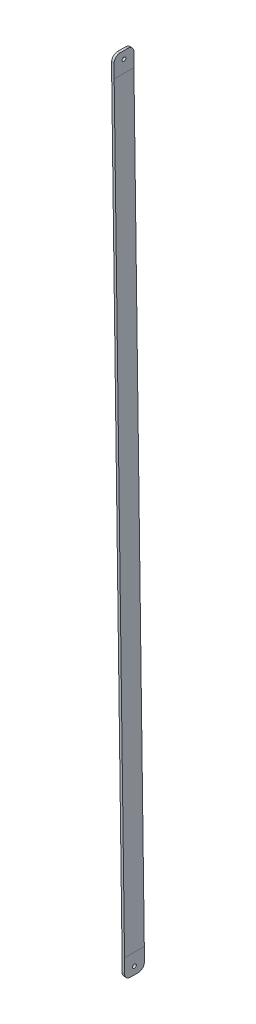
ISO-10303-21;
HEADER;
FILE_DESCRIPTION(('STEP AP214'),'2;1');
FILE_NAME('part.step','',(''),(''),'','','');
FILE_SCHEMA(('AUTOMOTIVE_DESIGN { 1 0 10303 214 1 1 1 1 }'));
ENDSEC;
DATA;
#1=APPLICATION_CONTEXT('core data for automotive mechanical design processes');
#2=APPLICATION_PROTOCOL_DEFINITION('international standard','automotive_design',2000,#1);
#3=PRODUCT_CONTEXT('',#1,'mechanical');
#4=PRODUCT('Part','Part','',(#3));
#5=PRODUCT_RELATED_PRODUCT_CATEGORY('part','',(#4));
#6=PRODUCT_DEFINITION_FORMATION('','',#4);
#7=PRODUCT_DEFINITION_CONTEXT('part definition',#1,'design');
#8=PRODUCT_DEFINITION('design','',#6,#7);
#9=PRODUCT_DEFINITION_SHAPE('','',#8);
#10=(LENGTH_UNIT() NAMED_UNIT(*) SI_UNIT(.MILLI.,.METRE.));
#11=(NAMED_UNIT(*) PLANE_ANGLE_UNIT() SI_UNIT($,.RADIAN.));
#12=(NAMED_UNIT(*) SI_UNIT($,.STERADIAN.) SOLID_ANGLE_UNIT());
#13=UNCERTAINTY_MEASURE_WITH_UNIT(LENGTH_MEASURE(1.E-05),#10,'distance_accuracy_value','');
#14=(GEOMETRIC_REPRESENTATION_CONTEXT(3) GLOBAL_UNCERTAINTY_ASSIGNED_CONTEXT((#13)) GLOBAL_UNIT_ASSIGNED_CONTEXT((#10,
#11,#12)) REPRESENTATION_CONTEXT('',''));
#15=CARTESIAN_POINT('',(0.,0.,0.));
#16=DIRECTION('',(0.,0.,1.));
#17=DIRECTION('',(1.,0.,0.));
#18=AXIS2_PLACEMENT_3D('',#15,#16,#17);
#19=CARTESIAN_POINT('',(0.,0.,12.7));
#20=DIRECTION('',(1.,0.,0.));
#21=DIRECTION('',(0.,0.,-1.));
#22=AXIS2_PLACEMENT_3D('',#19,#20,#21);
#23=PLANE('',#22);
#24=CARTESIAN_POINT('',(0.,9.65199999999977,0.));
#25=DIRECTION('',(1.,0.,0.));
#26=DIRECTION('',(0.,0.,-1.));
#27=AXIS2_PLACEMENT_3D('',#24,#25,#26);
#28=CIRCLE('',#27,2.413);
#29=CARTESIAN_POINT('',(0.,9.65199999999977,-2.413));
#30=VERTEX_POINT('',#29);
#31=EDGE_CURVE('E163',#30,#30,#28,.T.);
#32=ORIENTED_EDGE('',*,*,#31,.T.);
#33=EDGE_LOOP('',(#32));
#34=FACE_BOUND('',#33,.T.);
#35=DIRECTION('',(0.,0.,-1.));
#36=VECTOR('',#35,1.);
#37=CARTESIAN_POINT('',(0.,0.,12.7));
#38=LINE('',#37,#36);
#39=CARTESIAN_POINT('',(0.,0.,5.08));
#40=VERTEX_POINT('',#39);
#41=CARTESIAN_POINT('',(0.,0.,-5.08));
#42=VERTEX_POINT('',#41);
#43=EDGE_CURVE('E186',#40,#42,#38,.T.);
#44=ORIENTED_EDGE('',*,*,#43,.F.);
#45=CARTESIAN_POINT('',(0.,7.62,5.08));
#46=DIRECTION('',(1.,0.,0.));
#47=DIRECTION('',(0.,0.,-1.));
#48=AXIS2_PLACEMENT_3D('',#45,#46,#47);
#49=CIRCLE('',#48,7.62);
#50=CARTESIAN_POINT('',(0.,7.62,12.7));
#51=VERTEX_POINT('',#50);
#52=EDGE_CURVE('E204',#40,#51,#49,.F.);
#53=ORIENTED_EDGE('',*,*,#52,.T.);
#54=DIRECTION('',(0.,-1.,0.));
#55=VECTOR('',#54,1.);
#56=CARTESIAN_POINT('',(0.,0.,12.7));
#57=LINE('',#56,#55);
#58=CARTESIAN_POINT('',(0.,25.4,12.7));
#59=VERTEX_POINT('',#58);
#60=EDGE_CURVE('E135',#59,#51,#57,.T.);
#61=ORIENTED_EDGE('',*,*,#60,.F.);
#62=DIRECTION('',(0.,0.,-1.));
#63=VECTOR('',#62,1.);
#64=CARTESIAN_POINT('',(0.,25.4,12.7));
#65=LINE('',#64,#63);
#66=CARTESIAN_POINT('',(0.,25.4,-12.7));
#67=VERTEX_POINT('',#66);
#68=EDGE_CURVE('E159',#59,#67,#65,.T.);
#69=ORIENTED_EDGE('',*,*,#68,.T.);
#70=DIRECTION('',(0.,-1.,0.));
#71=VECTOR('',#70,1.);
#72=CARTESIAN_POINT('',(0.,0.,-12.7));
#73=LINE('',#72,#71);
#74=CARTESIAN_POINT('',(0.,7.62,-12.7));
#75=VERTEX_POINT('',#74);
#76=EDGE_CURVE('E160',#67,#75,#73,.T.);
#77=ORIENTED_EDGE('',*,*,#76,.T.);
#78=CARTESIAN_POINT('',(0.,7.62,-5.08));
#79=DIRECTION('',(1.,0.,0.));
#80=DIRECTION('',(0.,0.,-1.));
#81=AXIS2_PLACEMENT_3D('',#78,#79,#80);
#82=CIRCLE('',#81,7.62);
#83=EDGE_CURVE('E202',#75,#42,#82,.F.);
#84=ORIENTED_EDGE('',*,*,#83,.T.);
#85=EDGE_LOOP('',(#44,#53,#61,#69,#77,#84));
#86=FACE_BOUND('',#85,.T.);
#87=ADVANCED_FACE('F35',(#34,#86),#23,.F.);
#88=CARTESIAN_POINT('',(0.,0.,12.7));
#89=DIRECTION('',(0.,1.,0.));
#90=DIRECTION('',(0.,0.,1.));
#91=AXIS2_PLACEMENT_3D('',#88,#89,#90);
#92=PLANE('',#91);
#93=DIRECTION('',(0.,0.,-1.));
#94=VECTOR('',#93,1.);
#95=CARTESIAN_POINT('',(3.175,0.,12.7));
#96=LINE('',#95,#94);
#97=CARTESIAN_POINT('',(3.175,0.,5.08));
#98=VERTEX_POINT('',#97);
#99=CARTESIAN_POINT('',(3.175,0.,-5.08));
#100=VERTEX_POINT('',#99);
#101=EDGE_CURVE('E144',#98,#100,#96,.T.);
#102=ORIENTED_EDGE('',*,*,#101,.F.);
#103=DIRECTION('',(1.,0.,0.));
#104=VECTOR('',#103,1.);
#105=CARTESIAN_POINT('',(0.,0.,5.08));
#106=LINE('',#105,#104);
#107=EDGE_CURVE('E200',#98,#40,#106,.F.);
#108=ORIENTED_EDGE('',*,*,#107,.T.);
#109=ORIENTED_EDGE('',*,*,#43,.T.);
#110=DIRECTION('',(1.,0.,0.));
#111=VECTOR('',#110,1.);
#112=CARTESIAN_POINT('',(3.175,0.,-5.08));
#113=LINE('',#112,#111);
#114=EDGE_CURVE('E197',#42,#100,#113,.T.);
#115=ORIENTED_EDGE('',*,*,#114,.T.);
#116=EDGE_LOOP('',(#102,#108,#109,#115));
#117=FACE_BOUND('',#116,.T.);
#118=ADVANCED_FACE('F275',(#117),#92,.F.);
#119=CARTESIAN_POINT('',(3.175,0.,12.7));
#120=DIRECTION('',(-1.,0.,0.));
#121=DIRECTION('',(0.,0.,1.));
#122=AXIS2_PLACEMENT_3D('',#119,#120,#121);
#123=PLANE('',#122);
#124=CARTESIAN_POINT('',(3.175,9.65199999999977,0.));
#125=DIRECTION('',(1.,0.,0.));
#126=DIRECTION('',(0.,0.,-1.));
#127=AXIS2_PLACEMENT_3D('',#124,#125,#126);
#128=CIRCLE('',#127,2.413);
#129=CARTESIAN_POINT('',(3.175,9.65199999999977,-2.413));
#130=VERTEX_POINT('',#129);
#131=EDGE_CURVE('E252',#130,#130,#128,.T.);
#132=ORIENTED_EDGE('',*,*,#131,.F.);
#133=EDGE_LOOP('',(#132));
#134=FACE_BOUND('',#133,.T.);
#135=DIRECTION('',(0.,1.,0.));
#136=VECTOR('',#135,1.);
#137=CARTESIAN_POINT('',(3.175,0.,12.7));
#138=LINE('',#137,#136);
#139=CARTESIAN_POINT('',(3.175,7.62,12.7));
#140=VERTEX_POINT('',#139);
#141=CARTESIAN_POINT('',(3.175,25.4,12.7));
#142=VERTEX_POINT('',#141);
#143=EDGE_CURVE('E124',#140,#142,#138,.T.);
#144=ORIENTED_EDGE('',*,*,#143,.F.);
#145=CARTESIAN_POINT('',(3.175,7.62,5.08));
#146=DIRECTION('',(-1.,0.,0.));
#147=DIRECTION('',(0.,0.,1.));
#148=AXIS2_PLACEMENT_3D('',#145,#146,#147);
#149=CIRCLE('',#148,7.62);
#150=EDGE_CURVE('E195',#140,#98,#149,.F.);
#151=ORIENTED_EDGE('',*,*,#150,.T.);
#152=ORIENTED_EDGE('',*,*,#101,.T.);
#153=CARTESIAN_POINT('',(3.175,7.62,-5.08));
#154=DIRECTION('',(-1.,0.,0.));
#155=DIRECTION('',(0.,0.,1.));
#156=AXIS2_PLACEMENT_3D('',#153,#154,#155);
#157=CIRCLE('',#156,7.62);
#158=CARTESIAN_POINT('',(3.175,7.62,-12.7));
#159=VERTEX_POINT('',#158);
#160=EDGE_CURVE('E193',#100,#159,#157,.F.);
#161=ORIENTED_EDGE('',*,*,#160,.T.);
#162=DIRECTION('',(0.,1.,0.));
#163=VECTOR('',#162,1.);
#164=CARTESIAN_POINT('',(3.175,0.,-12.7));
#165=LINE('',#164,#163);
#166=CARTESIAN_POINT('',(3.175,25.4,-12.7));
#167=VERTEX_POINT('',#166);
#168=EDGE_CURVE('E141',#159,#167,#165,.T.);
#169=ORIENTED_EDGE('',*,*,#168,.T.);
#170=DIRECTION('',(0.,0.,-1.));
#171=VECTOR('',#170,1.);
#172=CARTESIAN_POINT('',(3.175,25.4,12.7));
#173=LINE('',#172,#171);
#174=EDGE_CURVE('E138',#142,#167,#173,.T.);
#175=ORIENTED_EDGE('',*,*,#174,.F.);
#176=EDGE_LOOP('',(#144,#151,#152,#161,#169,#175));
#177=FACE_BOUND('',#176,.T.);
#178=ADVANCED_FACE('F139',(#134,#177),#123,.F.);
#179=CARTESIAN_POINT('',(3.175,25.4,12.7));
#180=DIRECTION('',(-0.999905818766267,-0.0137241975124782,0.));
#181=DIRECTION('',(0.0137241975124782,-0.999905818766267,0.));
#182=AXIS2_PLACEMENT_3D('',#179,#180,#181);
#183=PLANE('',#182);
#184=DIRECTION('',(-0.0137241975124782,0.999905818766267,0.));
#185=VECTOR('',#184,1.);
#186=CARTESIAN_POINT('',(3.175,25.4,-12.7));
#187=LINE('',#186,#185);
#188=CARTESIAN_POINT('',(-10.16,996.95,-12.7));
#189=VERTEX_POINT('',#188);
#190=EDGE_CURVE('E165',#167,#189,#187,.T.);
#191=ORIENTED_EDGE('',*,*,#190,.T.);
#192=DIRECTION('',(0.,0.,-1.));
#193=VECTOR('',#192,1.);
#194=CARTESIAN_POINT('',(-10.16,996.95,12.7));
#195=LINE('',#194,#193);
#196=CARTESIAN_POINT('',(-10.16,996.95,12.7));
#197=VERTEX_POINT('',#196);
#198=EDGE_CURVE('E145',#197,#189,#195,.T.);
#199=ORIENTED_EDGE('',*,*,#198,.F.);
#200=DIRECTION('',(-0.0137241975124782,0.999905818766267,0.));
#201=VECTOR('',#200,1.);
#202=CARTESIAN_POINT('',(3.175,25.4,12.7));
#203=LINE('',#202,#201);
#204=EDGE_CURVE('E130',#142,#197,#203,.T.);
#205=ORIENTED_EDGE('',*,*,#204,.F.);
#206=ORIENTED_EDGE('',*,*,#174,.T.);
#207=EDGE_LOOP('',(#191,#199,#205,#206));
#208=FACE_BOUND('',#207,.T.);
#209=ADVANCED_FACE('F147',(#208),#183,.F.);
#210=CARTESIAN_POINT('',(-10.16,996.95,12.7));
#211=DIRECTION('',(-1.,0.,0.));
#212=DIRECTION('',(0.,0.,1.));
#213=AXIS2_PLACEMENT_3D('',#210,#211,#212);
#214=PLANE('',#213);
#215=CARTESIAN_POINT('',(-10.16,1012.698,0.));
#216=DIRECTION('',(-1.,0.,0.));
#217=DIRECTION('',(0.,0.,1.));
#218=AXIS2_PLACEMENT_3D('',#215,#216,#217);
#219=CIRCLE('',#218,2.41300000000001);
#220=CARTESIAN_POINT('',(-10.16,1012.698,2.41300000000001));
#221=VERTEX_POINT('',#220);
#222=EDGE_CURVE('E248',#221,#221,#219,.T.);
#223=ORIENTED_EDGE('',*,*,#222,.T.);
#224=EDGE_LOOP('',(#223));
#225=FACE_BOUND('',#224,.T.);
#226=DIRECTION('',(0.,1.,0.));
#227=VECTOR('',#226,1.);
#228=CARTESIAN_POINT('',(-10.16,996.95,-12.7));
#229=LINE('',#228,#227);
#230=CARTESIAN_POINT('',(-10.16,1014.73,-12.7));
#231=VERTEX_POINT('',#230);
#232=EDGE_CURVE('E167',#189,#231,#229,.T.);
#233=ORIENTED_EDGE('',*,*,#232,.T.);
#234=CARTESIAN_POINT('',(-10.16,1014.73,-5.08));
#235=DIRECTION('',(-1.,0.,0.));
#236=DIRECTION('',(0.,0.,1.));
#237=AXIS2_PLACEMENT_3D('',#234,#235,#236);
#238=CIRCLE('',#237,7.62);
#239=CARTESIAN_POINT('',(-10.16,1022.35,-5.08));
#240=VERTEX_POINT('',#239);
#241=EDGE_CURVE('E11',#231,#240,#238,.F.);
#242=ORIENTED_EDGE('',*,*,#241,.T.);
#243=DIRECTION('',(0.,0.,-1.));
#244=VECTOR('',#243,1.);
#245=CARTESIAN_POINT('',(-10.16,1022.35,12.7));
#246=LINE('',#245,#244);
#247=CARTESIAN_POINT('',(-10.16,1022.35,5.08));
#248=VERTEX_POINT('',#247);
#249=EDGE_CURVE('E181',#248,#240,#246,.T.);
#250=ORIENTED_EDGE('',*,*,#249,.F.);
#251=CARTESIAN_POINT('',(-10.16,1014.73,5.08));
#252=DIRECTION('',(-1.,0.,0.));
#253=DIRECTION('',(0.,0.,1.));
#254=AXIS2_PLACEMENT_3D('',#251,#252,#253);
#255=CIRCLE('',#254,7.62);
#256=CARTESIAN_POINT('',(-10.16,1014.73,12.7));
#257=VERTEX_POINT('',#256);
#258=EDGE_CURVE('E43',#248,#257,#255,.F.);
#259=ORIENTED_EDGE('',*,*,#258,.T.);
#260=DIRECTION('',(0.,1.,0.));
#261=VECTOR('',#260,1.);
#262=CARTESIAN_POINT('',(-10.16,996.95,12.7));
#263=LINE('',#262,#261);
#264=EDGE_CURVE('E150',#197,#257,#263,.T.);
#265=ORIENTED_EDGE('',*,*,#264,.F.);
#266=ORIENTED_EDGE('',*,*,#198,.T.);
#267=EDGE_LOOP('',(#233,#242,#250,#259,#265,#266));
#268=FACE_BOUND('',#267,.T.);
#269=ADVANCED_FACE('F218',(#225,#268),#214,.F.);
#270=CARTESIAN_POINT('',(-13.335,1022.35,12.7));
#271=DIRECTION('',(0.,-1.,0.));
#272=DIRECTION('',(0.,0.,-1.));
#273=AXIS2_PLACEMENT_3D('',#270,#271,#272);
#274=PLANE('',#273);
#275=ORIENTED_EDGE('',*,*,#249,.T.);
#276=DIRECTION('',(-1.,0.,0.));
#277=VECTOR('',#276,1.);
#278=CARTESIAN_POINT('',(-13.335,1022.35,-5.08));
#279=LINE('',#278,#277);
#280=CARTESIAN_POINT('',(-13.335,1022.35,-5.08));
#281=VERTEX_POINT('',#280);
#282=EDGE_CURVE('E211',#240,#281,#279,.T.);
#283=ORIENTED_EDGE('',*,*,#282,.T.);
#284=DIRECTION('',(0.,0.,-1.));
#285=VECTOR('',#284,1.);
#286=CARTESIAN_POINT('',(-13.335,1022.35,12.7));
#287=LINE('',#286,#285);
#288=CARTESIAN_POINT('',(-13.335,1022.35,5.08));
#289=VERTEX_POINT('',#288);
#290=EDGE_CURVE('E178',#289,#281,#287,.T.);
#291=ORIENTED_EDGE('',*,*,#290,.F.);
#292=DIRECTION('',(-1.,0.,0.));
#293=VECTOR('',#292,1.);
#294=CARTESIAN_POINT('',(-13.335,1022.35,5.08));
#295=LINE('',#294,#293);
#296=EDGE_CURVE('E55',#289,#248,#295,.F.);
#297=ORIENTED_EDGE('',*,*,#296,.T.);
#298=EDGE_LOOP('',(#275,#283,#291,#297));
#299=FACE_BOUND('',#298,.T.);
#300=ADVANCED_FACE('F225',(#299),#274,.F.);
#301=CARTESIAN_POINT('',(-13.335,1022.35,12.7));
#302=DIRECTION('',(1.,0.,0.));
#303=DIRECTION('',(0.,1.,0.));
#304=AXIS2_PLACEMENT_3D('',#301,#302,#303);
#305=PLANE('',#304);
#306=CARTESIAN_POINT('',(-13.335,1012.698,0.));
#307=DIRECTION('',(1.,0.,0.));
#308=DIRECTION('',(0.,0.,-1.));
#309=AXIS2_PLACEMENT_3D('',#306,#307,#308);
#310=CIRCLE('',#309,2.41300000000001);
#311=CARTESIAN_POINT('',(-13.335,1012.698,-2.41300000000001));
#312=VERTEX_POINT('',#311);
#313=EDGE_CURVE('E251',#312,#312,#310,.T.);
#314=ORIENTED_EDGE('',*,*,#313,.T.);
#315=EDGE_LOOP('',(#314));
#316=FACE_BOUND('',#315,.T.);
#317=ORIENTED_EDGE('',*,*,#290,.T.);
#318=CARTESIAN_POINT('',(-13.335,1014.73,-5.08));
#319=DIRECTION('',(1.,0.,0.));
#320=DIRECTION('',(0.,1.,0.));
#321=AXIS2_PLACEMENT_3D('',#318,#319,#320);
#322=CIRCLE('',#321,7.62);
#323=CARTESIAN_POINT('',(-13.335,1014.73,-12.7));
#324=VERTEX_POINT('',#323);
#325=EDGE_CURVE('E216',#281,#324,#322,.F.);
#326=ORIENTED_EDGE('',*,*,#325,.T.);
#327=DIRECTION('',(0.,-1.,0.));
#328=VECTOR('',#327,1.);
#329=CARTESIAN_POINT('',(-13.335,1022.35,-12.7));
#330=LINE('',#329,#328);
#331=CARTESIAN_POINT('',(-13.335,996.95,-12.7));
#332=VERTEX_POINT('',#331);
#333=EDGE_CURVE('E169',#324,#332,#330,.T.);
#334=ORIENTED_EDGE('',*,*,#333,.T.);
#335=DIRECTION('',(0.,0.,-1.));
#336=VECTOR('',#335,1.);
#337=CARTESIAN_POINT('',(-13.335,996.95,12.7));
#338=LINE('',#337,#336);
#339=CARTESIAN_POINT('',(-13.335,996.95,12.7));
#340=VERTEX_POINT('',#339);
#341=EDGE_CURVE('E175',#340,#332,#338,.T.);
#342=ORIENTED_EDGE('',*,*,#341,.F.);
#343=DIRECTION('',(0.,-1.,0.));
#344=VECTOR('',#343,1.);
#345=CARTESIAN_POINT('',(-13.335,1022.35,12.7));
#346=LINE('',#345,#344);
#347=CARTESIAN_POINT('',(-13.335,1014.73,12.7));
#348=VERTEX_POINT('',#347);
#349=EDGE_CURVE('E152',#348,#340,#346,.T.);
#350=ORIENTED_EDGE('',*,*,#349,.F.);
#351=CARTESIAN_POINT('',(-13.335,1014.73,5.08));
#352=DIRECTION('',(1.,0.,0.));
#353=DIRECTION('',(0.,1.,0.));
#354=AXIS2_PLACEMENT_3D('',#351,#352,#353);
#355=CIRCLE('',#354,7.62);
#356=EDGE_CURVE('E214',#348,#289,#355,.F.);
#357=ORIENTED_EDGE('',*,*,#356,.T.);
#358=EDGE_LOOP('',(#317,#326,#334,#342,#350,#357));
#359=FACE_BOUND('',#358,.T.);
#360=ADVANCED_FACE('F223',(#316,#359),#305,.F.);
#361=CARTESIAN_POINT('',(0.,25.4,12.7));
#362=DIRECTION('',(0.999905818766267,0.0137241975124782,0.));
#363=DIRECTION('',(-0.0137241975124782,0.999905818766267,0.));
#364=AXIS2_PLACEMENT_3D('',#361,#362,#363);
#365=PLANE('',#364);
#366=DIRECTION('',(0.0137241975124782,-0.999905818766267,0.));
#367=VECTOR('',#366,1.);
#368=CARTESIAN_POINT('',(0.,25.4,-12.7));
#369=LINE('',#368,#367);
#370=EDGE_CURVE('E171',#332,#67,#369,.T.);
#371=ORIENTED_EDGE('',*,*,#370,.T.);
#372=ORIENTED_EDGE('',*,*,#68,.F.);
#373=DIRECTION('',(0.0137241975124782,-0.999905818766267,0.));
#374=VECTOR('',#373,1.);
#375=CARTESIAN_POINT('',(0.,25.4,12.7));
#376=LINE('',#375,#374);
#377=EDGE_CURVE('E157',#340,#59,#376,.T.);
#378=ORIENTED_EDGE('',*,*,#377,.F.);
#379=ORIENTED_EDGE('',*,*,#341,.T.);
#380=EDGE_LOOP('',(#371,#372,#378,#379));
#381=FACE_BOUND('',#380,.T.);
#382=ADVANCED_FACE('F238',(#381),#365,.F.);
#383=CARTESIAN_POINT('',(0.,0.,12.7));
#384=DIRECTION('',(0.,0.,-1.));
#385=DIRECTION('',(-1.,0.,0.));
#386=AXIS2_PLACEMENT_3D('',#383,#384,#385);
#387=PLANE('',#386);
#388=ORIENTED_EDGE('',*,*,#60,.T.);
#389=DIRECTION('',(1.,0.,0.));
#390=VECTOR('',#389,1.);
#391=CARTESIAN_POINT('',(0.,7.62,12.7));
#392=LINE('',#391,#390);
#393=EDGE_CURVE('E133',#51,#140,#392,.T.);
#394=ORIENTED_EDGE('',*,*,#393,.T.);
#395=ORIENTED_EDGE('',*,*,#143,.T.);
#396=ORIENTED_EDGE('',*,*,#204,.T.);
#397=ORIENTED_EDGE('',*,*,#264,.T.);
#398=DIRECTION('',(-1.,0.,0.));
#399=VECTOR('',#398,1.);
#400=CARTESIAN_POINT('',(0.,1014.73,12.7));
#401=LINE('',#400,#399);
#402=EDGE_CURVE('E189',#257,#348,#401,.T.);
#403=ORIENTED_EDGE('',*,*,#402,.T.);
#404=ORIENTED_EDGE('',*,*,#349,.T.);
#405=ORIENTED_EDGE('',*,*,#377,.T.);
#406=EDGE_LOOP('',(#388,#394,#395,#396,#397,#403,#404,#405));
#407=FACE_BOUND('',#406,.T.);
#408=ADVANCED_FACE('F127',(#407),#387,.F.);
#409=CARTESIAN_POINT('',(0.,0.,-12.7));
#410=DIRECTION('',(0.,0.,-1.));
#411=DIRECTION('',(-1.,0.,0.));
#412=AXIS2_PLACEMENT_3D('',#409,#410,#411);
#413=PLANE('',#412);
#414=ORIENTED_EDGE('',*,*,#168,.F.);
#415=DIRECTION('',(1.,0.,0.));
#416=VECTOR('',#415,1.);
#417=CARTESIAN_POINT('',(0.,7.62,-12.7));
#418=LINE('',#417,#416);
#419=EDGE_CURVE('E208',#159,#75,#418,.F.);
#420=ORIENTED_EDGE('',*,*,#419,.T.);
#421=ORIENTED_EDGE('',*,*,#76,.F.);
#422=ORIENTED_EDGE('',*,*,#370,.F.);
#423=ORIENTED_EDGE('',*,*,#333,.F.);
#424=DIRECTION('',(-1.,0.,0.));
#425=VECTOR('',#424,1.);
#426=CARTESIAN_POINT('',(-10.16,1014.73,-12.7));
#427=LINE('',#426,#425);
#428=EDGE_CURVE('E206',#324,#231,#427,.F.);
#429=ORIENTED_EDGE('',*,*,#428,.T.);
#430=ORIENTED_EDGE('',*,*,#232,.F.);
#431=ORIENTED_EDGE('',*,*,#190,.F.);
#432=EDGE_LOOP('',(#414,#420,#421,#422,#423,#429,#430,#431));
#433=FACE_BOUND('',#432,.T.);
#434=ADVANCED_FACE('F233',(#433),#413,.T.);
#435=CARTESIAN_POINT('',(0.,7.62,5.08));
#436=DIRECTION('',(1.,0.,0.));
#437=DIRECTION('',(0.,0.,-1.));
#438=AXIS2_PLACEMENT_3D('',#435,#436,#437);
#439=CYLINDRICAL_SURFACE('',#438,7.62);
#440=ORIENTED_EDGE('',*,*,#52,.F.);
#441=ORIENTED_EDGE('',*,*,#107,.F.);
#442=ORIENTED_EDGE('',*,*,#150,.F.);
#443=ORIENTED_EDGE('',*,*,#393,.F.);
#444=EDGE_LOOP('',(#440,#441,#442,#443));
#445=FACE_BOUND('',#444,.T.);
#446=ADVANCED_FACE('F285',(#445),#439,.T.);
#447=CARTESIAN_POINT('',(0.,7.62,-5.08));
#448=DIRECTION('',(-1.,0.,0.));
#449=DIRECTION('',(0.,0.,1.));
#450=AXIS2_PLACEMENT_3D('',#447,#448,#449);
#451=CYLINDRICAL_SURFACE('',#450,7.62);
#452=ORIENTED_EDGE('',*,*,#83,.F.);
#453=ORIENTED_EDGE('',*,*,#419,.F.);
#454=ORIENTED_EDGE('',*,*,#160,.F.);
#455=ORIENTED_EDGE('',*,*,#114,.F.);
#456=EDGE_LOOP('',(#452,#453,#454,#455));
#457=FACE_BOUND('',#456,.T.);
#458=ADVANCED_FACE('F288',(#457),#451,.T.);
#459=CARTESIAN_POINT('',(-13.335,1014.73,-5.08));
#460=DIRECTION('',(1.,0.,0.));
#461=DIRECTION('',(0.,0.,-1.));
#462=AXIS2_PLACEMENT_3D('',#459,#460,#461);
#463=CYLINDRICAL_SURFACE('',#462,7.62);
#464=ORIENTED_EDGE('',*,*,#241,.F.);
#465=ORIENTED_EDGE('',*,*,#428,.F.);
#466=ORIENTED_EDGE('',*,*,#325,.F.);
#467=ORIENTED_EDGE('',*,*,#282,.F.);
#468=EDGE_LOOP('',(#464,#465,#466,#467));
#469=FACE_BOUND('',#468,.T.);
#470=ADVANCED_FACE('F228',(#469),#463,.T.);
#471=CARTESIAN_POINT('',(0.,1014.73,5.08));
#472=DIRECTION('',(-1.,0.,0.));
#473=DIRECTION('',(0.,0.,1.));
#474=AXIS2_PLACEMENT_3D('',#471,#472,#473);
#475=CYLINDRICAL_SURFACE('',#474,7.62);
#476=ORIENTED_EDGE('',*,*,#258,.F.);
#477=ORIENTED_EDGE('',*,*,#296,.F.);
#478=ORIENTED_EDGE('',*,*,#356,.F.);
#479=ORIENTED_EDGE('',*,*,#402,.F.);
#480=EDGE_LOOP('',(#476,#477,#478,#479));
#481=FACE_BOUND('',#480,.T.);
#482=ADVANCED_FACE('F37',(#481),#475,.T.);
#483=CARTESIAN_POINT('',(-13.335,1012.698,0.));
#484=DIRECTION('',(1.,0.,0.));
#485=DIRECTION('',(0.,0.,-1.));
#486=AXIS2_PLACEMENT_3D('',#483,#484,#485);
#487=CYLINDRICAL_SURFACE('',#486,2.41300000000001);
#488=ORIENTED_EDGE('',*,*,#313,.F.);
#489=EDGE_LOOP('',(#488));
#490=FACE_BOUND('',#489,.T.);
#491=ORIENTED_EDGE('',*,*,#222,.F.);
#492=EDGE_LOOP('',(#491));
#493=FACE_BOUND('',#492,.T.);
#494=ADVANCED_FACE('F259',(#490,#493),#487,.F.);
#495=CARTESIAN_POINT('',(-13.335,9.65199999999977,0.));
#496=DIRECTION('',(1.,0.,0.));
#497=DIRECTION('',(0.,0.,-1.));
#498=AXIS2_PLACEMENT_3D('',#495,#496,#497);
#499=CYLINDRICAL_SURFACE('',#498,2.413);
#500=ORIENTED_EDGE('',*,*,#131,.T.);
#501=EDGE_LOOP('',(#500));
#502=FACE_BOUND('',#501,.T.);
#503=ORIENTED_EDGE('',*,*,#31,.F.);
#504=EDGE_LOOP('',(#503));
#505=FACE_BOUND('',#504,.T.);
#506=ADVANCED_FACE('F262',(#502,#505),#499,.F.);
#507=CLOSED_SHELL('',(#87,#118,#178,#209,#269,#300,#360,#382,#408,#434,#446,#458,#470,#482,#494,#506));
#508=MANIFOLD_SOLID_BREP('B2',#507);
#509=ADVANCED_BREP_SHAPE_REPRESENTATION('',(#18,#508),#14);
#510=SHAPE_DEFINITION_REPRESENTATION(#9,#509);
ENDSEC;
END-ISO-10303-21;
